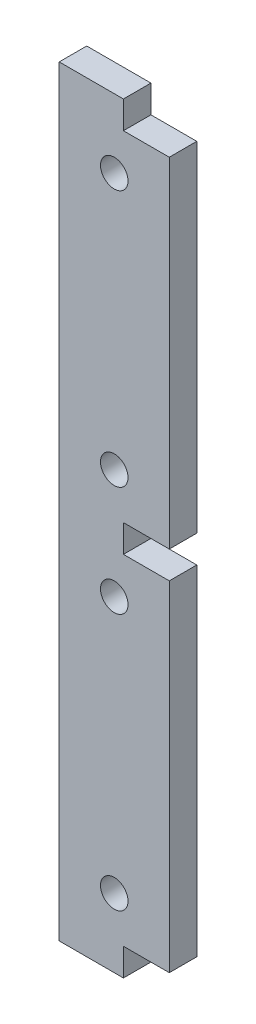
ISO-10303-21;
HEADER;
FILE_DESCRIPTION(('STEP AP214'),'2;1');
FILE_NAME('part.step','',(''),(''),'','','');
FILE_SCHEMA(('AUTOMOTIVE_DESIGN { 1 0 10303 214 1 1 1 1 }'));
ENDSEC;
DATA;
#1=APPLICATION_CONTEXT('core data for automotive mechanical design processes');
#2=APPLICATION_PROTOCOL_DEFINITION('international standard','automotive_design',2000,#1);
#3=PRODUCT_CONTEXT('',#1,'mechanical');
#4=PRODUCT('Part','Part','',(#3));
#5=PRODUCT_RELATED_PRODUCT_CATEGORY('part','',(#4));
#6=PRODUCT_DEFINITION_FORMATION('','',#4);
#7=PRODUCT_DEFINITION_CONTEXT('part definition',#1,'design');
#8=PRODUCT_DEFINITION('design','',#6,#7);
#9=PRODUCT_DEFINITION_SHAPE('','',#8);
#10=(LENGTH_UNIT() NAMED_UNIT(*) SI_UNIT(.MILLI.,.METRE.));
#11=(NAMED_UNIT(*) PLANE_ANGLE_UNIT() SI_UNIT($,.RADIAN.));
#12=(NAMED_UNIT(*) SI_UNIT($,.STERADIAN.) SOLID_ANGLE_UNIT());
#13=UNCERTAINTY_MEASURE_WITH_UNIT(LENGTH_MEASURE(1.E-05),#10,'distance_accuracy_value','');
#14=(GEOMETRIC_REPRESENTATION_CONTEXT(3) GLOBAL_UNCERTAINTY_ASSIGNED_CONTEXT((#13)) GLOBAL_UNIT_ASSIGNED_CONTEXT((#10,
#11,#12)) REPRESENTATION_CONTEXT('',''));
#15=CARTESIAN_POINT('',(0.,0.,0.));
#16=DIRECTION('',(0.,0.,1.));
#17=DIRECTION('',(1.,0.,0.));
#18=AXIS2_PLACEMENT_3D('',#15,#16,#17);
#19=CARTESIAN_POINT('',(0.,0.,3.));
#20=DIRECTION('',(0.,0.,1.));
#21=DIRECTION('',(1.,0.,0.));
#22=AXIS2_PLACEMENT_3D('',#19,#20,#21);
#23=PLANE('',#22);
#24=DIRECTION('',(1.,0.,0.));
#25=VECTOR('',#24,1.);
#26=CARTESIAN_POINT('',(-5.99999999999996,100.5,3.));
#27=LINE('',#26,#25);
#28=CARTESIAN_POINT('',(-5.99999999999996,100.5,3.));
#29=VERTEX_POINT('',#28);
#30=CARTESIAN_POINT('',(0.999999999999977,100.5,3.));
#31=VERTEX_POINT('',#30);
#32=EDGE_CURVE('E54',#29,#31,#27,.T.);
#33=ORIENTED_EDGE('',*,*,#32,.F.);
#34=DIRECTION('',(0.,-1.,0.));
#35=VECTOR('',#34,1.);
#36=CARTESIAN_POINT('',(-5.99999999999996,118.,3.));
#37=LINE('',#36,#35);
#38=CARTESIAN_POINT('',(-5.99999999999995,17.5,3.));
#39=VERTEX_POINT('',#38);
#40=EDGE_CURVE('E165',#29,#39,#37,.T.);
#41=ORIENTED_EDGE('',*,*,#40,.T.);
#42=DIRECTION('',(-1.,0.,0.));
#43=VECTOR('',#42,1.);
#44=CARTESIAN_POINT('',(-5.99999999999995,17.5,3.));
#45=LINE('',#44,#43);
#46=CARTESIAN_POINT('',(0.999999999999999,17.5,3.));
#47=VERTEX_POINT('',#46);
#48=EDGE_CURVE('E243',#47,#39,#45,.T.);
#49=ORIENTED_EDGE('',*,*,#48,.F.);
#50=DIRECTION('',(0.,1.,0.));
#51=VECTOR('',#50,1.);
#52=CARTESIAN_POINT('',(1.,20.5,3.));
#53=LINE('',#52,#51);
#54=CARTESIAN_POINT('',(1.,20.5,3.));
#55=VERTEX_POINT('',#54);
#56=EDGE_CURVE('E104',#47,#55,#53,.T.);
#57=ORIENTED_EDGE('',*,*,#56,.T.);
#58=DIRECTION('',(1.,0.,0.));
#59=VECTOR('',#58,1.);
#60=CARTESIAN_POINT('',(6.00000000000004,20.5,3.));
#61=LINE('',#60,#59);
#62=CARTESIAN_POINT('',(6.00000000000004,20.5,3.));
#63=VERTEX_POINT('',#62);
#64=EDGE_CURVE('E186',#55,#63,#61,.T.);
#65=ORIENTED_EDGE('',*,*,#64,.T.);
#66=DIRECTION('',(0.,1.,0.));
#67=VECTOR('',#66,1.);
#68=CARTESIAN_POINT('',(6.00000000000004,57.5,3.));
#69=LINE('',#68,#67);
#70=CARTESIAN_POINT('',(6.00000000000004,57.5,3.));
#71=VERTEX_POINT('',#70);
#72=EDGE_CURVE('E208',#63,#71,#69,.T.);
#73=ORIENTED_EDGE('',*,*,#72,.T.);
#74=DIRECTION('',(-1.,0.,0.));
#75=VECTOR('',#74,1.);
#76=CARTESIAN_POINT('',(0.999999999999985,57.5,3.));
#77=LINE('',#76,#75);
#78=CARTESIAN_POINT('',(0.999999999999985,57.5,3.));
#79=VERTEX_POINT('',#78);
#80=EDGE_CURVE('E205',#71,#79,#77,.T.);
#81=ORIENTED_EDGE('',*,*,#80,.T.);
#82=DIRECTION('',(0.,1.,0.));
#83=VECTOR('',#82,1.);
#84=CARTESIAN_POINT('',(0.999999999999986,60.5,3.));
#85=LINE('',#84,#83);
#86=CARTESIAN_POINT('',(0.999999999999986,60.5,3.));
#87=VERTEX_POINT('',#86);
#88=EDGE_CURVE('E207',#79,#87,#85,.T.);
#89=ORIENTED_EDGE('',*,*,#88,.T.);
#90=DIRECTION('',(1.,0.,0.));
#91=VECTOR('',#90,1.);
#92=CARTESIAN_POINT('',(6.00000000000004,60.5,3.));
#93=LINE('',#92,#91);
#94=CARTESIAN_POINT('',(6.00000000000004,60.5,3.));
#95=VERTEX_POINT('',#94);
#96=EDGE_CURVE('E128',#87,#95,#93,.T.);
#97=ORIENTED_EDGE('',*,*,#96,.T.);
#98=DIRECTION('',(0.,1.,0.));
#99=VECTOR('',#98,1.);
#100=CARTESIAN_POINT('',(6.00000000000003,97.5,3.));
#101=LINE('',#100,#99);
#102=CARTESIAN_POINT('',(6.00000000000003,97.5,3.));
#103=VERTEX_POINT('',#102);
#104=EDGE_CURVE('E123',#95,#103,#101,.T.);
#105=ORIENTED_EDGE('',*,*,#104,.T.);
#106=DIRECTION('',(-1.,0.,0.));
#107=VECTOR('',#106,1.);
#108=CARTESIAN_POINT('',(0.999999999999977,97.5,3.));
#109=LINE('',#108,#107);
#110=CARTESIAN_POINT('',(0.999999999999977,97.5,3.));
#111=VERTEX_POINT('',#110);
#112=EDGE_CURVE('E126',#103,#111,#109,.T.);
#113=ORIENTED_EDGE('',*,*,#112,.T.);
#114=DIRECTION('',(0.,1.,0.));
#115=VECTOR('',#114,1.);
#116=CARTESIAN_POINT('',(0.999999999999977,100.5,3.));
#117=LINE('',#116,#115);
#118=EDGE_CURVE('E138',#111,#31,#117,.T.);
#119=ORIENTED_EDGE('',*,*,#118,.T.);
#120=EDGE_LOOP('',(#33,#41,#49,#57,#65,#73,#81,#89,#97,#105,#113,#119));
#121=FACE_BOUND('',#120,.T.);
#122=CARTESIAN_POINT('',(0.,25.,3.));
#123=DIRECTION('',(0.,0.,1.));
#124=DIRECTION('',(1.,0.,0.));
#125=AXIS2_PLACEMENT_3D('',#122,#123,#124);
#126=CIRCLE('',#125,1.5);
#127=CARTESIAN_POINT('',(1.5,25.,3.));
#128=VERTEX_POINT('',#127);
#129=EDGE_CURVE('E232',#128,#128,#126,.T.);
#130=ORIENTED_EDGE('',*,*,#129,.F.);
#131=EDGE_LOOP('',(#130));
#132=FACE_BOUND('',#131,.T.);
#133=CARTESIAN_POINT('',(0.,65.,3.));
#134=DIRECTION('',(0.,0.,1.));
#135=DIRECTION('',(1.,0.,0.));
#136=AXIS2_PLACEMENT_3D('',#133,#134,#135);
#137=CIRCLE('',#136,1.5);
#138=CARTESIAN_POINT('',(1.50000000000001,65.,3.));
#139=VERTEX_POINT('',#138);
#140=EDGE_CURVE('E220',#139,#139,#137,.T.);
#141=ORIENTED_EDGE('',*,*,#140,.F.);
#142=EDGE_LOOP('',(#141));
#143=FACE_BOUND('',#142,.T.);
#144=CARTESIAN_POINT('',(0.,93.,3.));
#145=DIRECTION('',(0.,0.,1.));
#146=DIRECTION('',(-1.,0.,0.));
#147=AXIS2_PLACEMENT_3D('',#144,#145,#146);
#148=CIRCLE('',#147,1.5);
#149=CARTESIAN_POINT('',(-1.5,93.,3.));
#150=VERTEX_POINT('',#149);
#151=EDGE_CURVE('E148',#150,#150,#148,.T.);
#152=ORIENTED_EDGE('',*,*,#151,.F.);
#153=EDGE_LOOP('',(#152));
#154=FACE_BOUND('',#153,.T.);
#155=CARTESIAN_POINT('',(0.,53.,3.));
#156=DIRECTION('',(0.,0.,1.));
#157=DIRECTION('',(-1.,0.,0.));
#158=AXIS2_PLACEMENT_3D('',#155,#156,#157);
#159=CIRCLE('',#158,1.5);
#160=CARTESIAN_POINT('',(-1.49999999999999,53.,3.));
#161=VERTEX_POINT('',#160);
#162=EDGE_CURVE('E226',#161,#161,#159,.T.);
#163=ORIENTED_EDGE('',*,*,#162,.F.);
#164=EDGE_LOOP('',(#163));
#165=FACE_BOUND('',#164,.T.);
#166=ADVANCED_FACE('F37',(#121,#132,#143,#154,#165),#23,.T.);
#167=CARTESIAN_POINT('',(0.,0.,0.));
#168=DIRECTION('',(0.,0.,1.));
#169=DIRECTION('',(1.,0.,0.));
#170=AXIS2_PLACEMENT_3D('',#167,#168,#169);
#171=PLANE('',#170);
#172=DIRECTION('',(0.,-1.,0.));
#173=VECTOR('',#172,1.);
#174=CARTESIAN_POINT('',(-5.99999999999996,118.,0.));
#175=LINE('',#174,#173);
#176=CARTESIAN_POINT('',(-5.99999999999996,100.5,0.));
#177=VERTEX_POINT('',#176);
#178=CARTESIAN_POINT('',(-5.99999999999995,17.5,0.));
#179=VERTEX_POINT('',#178);
#180=EDGE_CURVE('E144',#177,#179,#175,.T.);
#181=ORIENTED_EDGE('',*,*,#180,.F.);
#182=DIRECTION('',(1.,0.,0.));
#183=VECTOR('',#182,1.);
#184=CARTESIAN_POINT('',(-5.99999999999996,100.5,0.));
#185=LINE('',#184,#183);
#186=CARTESIAN_POINT('',(0.999999999999977,100.5,0.));
#187=VERTEX_POINT('',#186);
#188=EDGE_CURVE('E250',#177,#187,#185,.T.);
#189=ORIENTED_EDGE('',*,*,#188,.T.);
#190=DIRECTION('',(0.,1.,0.));
#191=VECTOR('',#190,1.);
#192=CARTESIAN_POINT('',(0.999999999999977,100.5,0.));
#193=LINE('',#192,#191);
#194=CARTESIAN_POINT('',(0.999999999999977,97.5,0.));
#195=VERTEX_POINT('',#194);
#196=EDGE_CURVE('E162',#195,#187,#193,.T.);
#197=ORIENTED_EDGE('',*,*,#196,.F.);
#198=DIRECTION('',(-1.,0.,0.));
#199=VECTOR('',#198,1.);
#200=CARTESIAN_POINT('',(0.999999999999977,97.5,0.));
#201=LINE('',#200,#199);
#202=CARTESIAN_POINT('',(6.00000000000003,97.5,0.));
#203=VERTEX_POINT('',#202);
#204=EDGE_CURVE('E95',#203,#195,#201,.T.);
#205=ORIENTED_EDGE('',*,*,#204,.F.);
#206=DIRECTION('',(0.,1.,0.));
#207=VECTOR('',#206,1.);
#208=CARTESIAN_POINT('',(6.00000000000003,97.5,0.));
#209=LINE('',#208,#207);
#210=CARTESIAN_POINT('',(6.00000000000004,60.5,0.));
#211=VERTEX_POINT('',#210);
#212=EDGE_CURVE('E88',#211,#203,#209,.T.);
#213=ORIENTED_EDGE('',*,*,#212,.F.);
#214=DIRECTION('',(1.,0.,0.));
#215=VECTOR('',#214,1.);
#216=CARTESIAN_POINT('',(6.00000000000004,60.5,0.));
#217=LINE('',#216,#215);
#218=CARTESIAN_POINT('',(0.999999999999986,60.5,0.));
#219=VERTEX_POINT('',#218);
#220=EDGE_CURVE('E158',#219,#211,#217,.T.);
#221=ORIENTED_EDGE('',*,*,#220,.F.);
#222=DIRECTION('',(0.,1.,0.));
#223=VECTOR('',#222,1.);
#224=CARTESIAN_POINT('',(0.999999999999986,60.5,0.));
#225=LINE('',#224,#223);
#226=CARTESIAN_POINT('',(0.999999999999985,57.5,0.));
#227=VERTEX_POINT('',#226);
#228=EDGE_CURVE('E156',#227,#219,#225,.T.);
#229=ORIENTED_EDGE('',*,*,#228,.F.);
#230=DIRECTION('',(-1.,0.,0.));
#231=VECTOR('',#230,1.);
#232=CARTESIAN_POINT('',(0.999999999999985,57.5,0.));
#233=LINE('',#232,#231);
#234=CARTESIAN_POINT('',(6.00000000000004,57.5,0.));
#235=VERTEX_POINT('',#234);
#236=EDGE_CURVE('E154',#235,#227,#233,.T.);
#237=ORIENTED_EDGE('',*,*,#236,.F.);
#238=DIRECTION('',(0.,1.,0.));
#239=VECTOR('',#238,1.);
#240=CARTESIAN_POINT('',(6.00000000000004,57.5,0.));
#241=LINE('',#240,#239);
#242=CARTESIAN_POINT('',(6.00000000000004,20.5,0.));
#243=VERTEX_POINT('',#242);
#244=EDGE_CURVE('E152',#243,#235,#241,.T.);
#245=ORIENTED_EDGE('',*,*,#244,.F.);
#246=DIRECTION('',(1.,0.,0.));
#247=VECTOR('',#246,1.);
#248=CARTESIAN_POINT('',(6.00000000000004,20.5,0.));
#249=LINE('',#248,#247);
#250=CARTESIAN_POINT('',(1.,20.5,0.));
#251=VERTEX_POINT('',#250);
#252=EDGE_CURVE('E150',#251,#243,#249,.T.);
#253=ORIENTED_EDGE('',*,*,#252,.F.);
#254=DIRECTION('',(0.,1.,0.));
#255=VECTOR('',#254,1.);
#256=CARTESIAN_POINT('',(1.,20.5,0.));
#257=LINE('',#256,#255);
#258=CARTESIAN_POINT('',(1.,17.5,0.));
#259=VERTEX_POINT('',#258);
#260=EDGE_CURVE('E147',#259,#251,#257,.T.);
#261=ORIENTED_EDGE('',*,*,#260,.F.);
#262=DIRECTION('',(-1.,0.,0.));
#263=VECTOR('',#262,1.);
#264=CARTESIAN_POINT('',(-5.99999999999995,17.5,0.));
#265=LINE('',#264,#263);
#266=EDGE_CURVE('E241',#259,#179,#265,.T.);
#267=ORIENTED_EDGE('',*,*,#266,.T.);
#268=EDGE_LOOP('',(#181,#189,#197,#205,#213,#221,#229,#237,#245,#253,#261,#267));
#269=FACE_BOUND('',#268,.T.);
#270=CARTESIAN_POINT('',(0.,93.,0.));
#271=DIRECTION('',(0.,0.,1.));
#272=DIRECTION('',(-1.,0.,0.));
#273=AXIS2_PLACEMENT_3D('',#270,#271,#272);
#274=CIRCLE('',#273,1.5);
#275=CARTESIAN_POINT('',(-1.5,93.,0.));
#276=VERTEX_POINT('',#275);
#277=EDGE_CURVE('E217',#276,#276,#274,.T.);
#278=ORIENTED_EDGE('',*,*,#277,.T.);
#279=EDGE_LOOP('',(#278));
#280=FACE_BOUND('',#279,.T.);
#281=CARTESIAN_POINT('',(0.,65.,0.));
#282=DIRECTION('',(0.,0.,1.));
#283=DIRECTION('',(1.,0.,0.));
#284=AXIS2_PLACEMENT_3D('',#281,#282,#283);
#285=CIRCLE('',#284,1.5);
#286=CARTESIAN_POINT('',(1.50000000000001,65.,0.));
#287=VERTEX_POINT('',#286);
#288=EDGE_CURVE('E223',#287,#287,#285,.T.);
#289=ORIENTED_EDGE('',*,*,#288,.T.);
#290=EDGE_LOOP('',(#289));
#291=FACE_BOUND('',#290,.T.);
#292=CARTESIAN_POINT('',(0.,53.,0.));
#293=DIRECTION('',(0.,0.,1.));
#294=DIRECTION('',(-1.,0.,0.));
#295=AXIS2_PLACEMENT_3D('',#292,#293,#294);
#296=CIRCLE('',#295,1.5);
#297=CARTESIAN_POINT('',(-1.49999999999999,53.,0.));
#298=VERTEX_POINT('',#297);
#299=EDGE_CURVE('E229',#298,#298,#296,.T.);
#300=ORIENTED_EDGE('',*,*,#299,.T.);
#301=EDGE_LOOP('',(#300));
#302=FACE_BOUND('',#301,.T.);
#303=CARTESIAN_POINT('',(0.,25.,0.));
#304=DIRECTION('',(0.,0.,1.));
#305=DIRECTION('',(1.,0.,0.));
#306=AXIS2_PLACEMENT_3D('',#303,#304,#305);
#307=CIRCLE('',#306,1.5);
#308=CARTESIAN_POINT('',(1.5,25.,0.));
#309=VERTEX_POINT('',#308);
#310=EDGE_CURVE('E235',#309,#309,#307,.T.);
#311=ORIENTED_EDGE('',*,*,#310,.T.);
#312=EDGE_LOOP('',(#311));
#313=FACE_BOUND('',#312,.T.);
#314=ADVANCED_FACE('F192',(#269,#280,#291,#302,#313),#171,.F.);
#315=CARTESIAN_POINT('',(-5.99999999999996,118.,3.));
#316=DIRECTION('',(1.,0.,0.));
#317=DIRECTION('',(0.,1.,0.));
#318=AXIS2_PLACEMENT_3D('',#315,#316,#317);
#319=PLANE('',#318);
#320=ORIENTED_EDGE('',*,*,#40,.F.);
#321=DIRECTION('',(0.,0.,1.));
#322=VECTOR('',#321,1.);
#323=CARTESIAN_POINT('',(-5.99999999999996,100.5,0.));
#324=LINE('',#323,#322);
#325=EDGE_CURVE('E238',#177,#29,#324,.T.);
#326=ORIENTED_EDGE('',*,*,#325,.F.);
#327=ORIENTED_EDGE('',*,*,#180,.T.);
#328=DIRECTION('',(0.,0.,1.));
#329=VECTOR('',#328,1.);
#330=CARTESIAN_POINT('',(-5.99999999999995,17.5,0.));
#331=LINE('',#330,#329);
#332=EDGE_CURVE('E244',#179,#39,#331,.T.);
#333=ORIENTED_EDGE('',*,*,#332,.T.);
#334=EDGE_LOOP('',(#320,#326,#327,#333));
#335=FACE_BOUND('',#334,.T.);
#336=ADVANCED_FACE('F39',(#335),#319,.F.);
#337=CARTESIAN_POINT('',(1.,20.5,3.));
#338=DIRECTION('',(-1.,0.,0.));
#339=DIRECTION('',(0.,0.,1.));
#340=AXIS2_PLACEMENT_3D('',#337,#338,#339);
#341=PLANE('',#340);
#342=ORIENTED_EDGE('',*,*,#260,.T.);
#343=DIRECTION('',(0.,0.,-1.));
#344=VECTOR('',#343,1.);
#345=CARTESIAN_POINT('',(1.,20.5,3.));
#346=LINE('',#345,#344);
#347=EDGE_CURVE('E46',#55,#251,#346,.T.);
#348=ORIENTED_EDGE('',*,*,#347,.F.);
#349=ORIENTED_EDGE('',*,*,#56,.F.);
#350=DIRECTION('',(0.,0.,-1.));
#351=VECTOR('',#350,1.);
#352=CARTESIAN_POINT('',(1.,17.5,3.));
#353=LINE('',#352,#351);
#354=EDGE_CURVE('E11',#47,#259,#353,.T.);
#355=ORIENTED_EDGE('',*,*,#354,.T.);
#356=EDGE_LOOP('',(#342,#348,#349,#355));
#357=FACE_BOUND('',#356,.T.);
#358=ADVANCED_FACE('F274',(#357),#341,.F.);
#359=CARTESIAN_POINT('',(6.00000000000004,20.5,3.));
#360=DIRECTION('',(0.,1.,0.));
#361=DIRECTION('',(0.,0.,1.));
#362=AXIS2_PLACEMENT_3D('',#359,#360,#361);
#363=PLANE('',#362);
#364=ORIENTED_EDGE('',*,*,#252,.T.);
#365=DIRECTION('',(0.,0.,-1.));
#366=VECTOR('',#365,1.);
#367=CARTESIAN_POINT('',(6.00000000000004,20.5,3.));
#368=LINE('',#367,#366);
#369=EDGE_CURVE('E178',#63,#243,#368,.T.);
#370=ORIENTED_EDGE('',*,*,#369,.F.);
#371=ORIENTED_EDGE('',*,*,#64,.F.);
#372=ORIENTED_EDGE('',*,*,#347,.T.);
#373=EDGE_LOOP('',(#364,#370,#371,#372));
#374=FACE_BOUND('',#373,.T.);
#375=ADVANCED_FACE('F184',(#374),#363,.F.);
#376=CARTESIAN_POINT('',(6.00000000000004,57.5,3.));
#377=DIRECTION('',(-1.,0.,0.));
#378=DIRECTION('',(0.,-1.,0.));
#379=AXIS2_PLACEMENT_3D('',#376,#377,#378);
#380=PLANE('',#379);
#381=ORIENTED_EDGE('',*,*,#244,.T.);
#382=DIRECTION('',(0.,0.,-1.));
#383=VECTOR('',#382,1.);
#384=CARTESIAN_POINT('',(6.00000000000004,57.5,3.));
#385=LINE('',#384,#383);
#386=EDGE_CURVE('E175',#71,#235,#385,.T.);
#387=ORIENTED_EDGE('',*,*,#386,.F.);
#388=ORIENTED_EDGE('',*,*,#72,.F.);
#389=ORIENTED_EDGE('',*,*,#369,.T.);
#390=EDGE_LOOP('',(#381,#387,#388,#389));
#391=FACE_BOUND('',#390,.T.);
#392=ADVANCED_FACE('F199',(#391),#380,.F.);
#393=CARTESIAN_POINT('',(0.999999999999985,57.5,3.));
#394=DIRECTION('',(0.,-1.,0.));
#395=DIRECTION('',(0.,0.,-1.));
#396=AXIS2_PLACEMENT_3D('',#393,#394,#395);
#397=PLANE('',#396);
#398=ORIENTED_EDGE('',*,*,#236,.T.);
#399=DIRECTION('',(0.,0.,-1.));
#400=VECTOR('',#399,1.);
#401=CARTESIAN_POINT('',(0.999999999999985,57.5,3.));
#402=LINE('',#401,#400);
#403=EDGE_CURVE('E172',#79,#227,#402,.T.);
#404=ORIENTED_EDGE('',*,*,#403,.F.);
#405=ORIENTED_EDGE('',*,*,#80,.F.);
#406=ORIENTED_EDGE('',*,*,#386,.T.);
#407=EDGE_LOOP('',(#398,#404,#405,#406));
#408=FACE_BOUND('',#407,.T.);
#409=ADVANCED_FACE('F203',(#408),#397,.F.);
#410=CARTESIAN_POINT('',(0.999999999999986,60.5,3.));
#411=DIRECTION('',(-1.,0.,0.));
#412=DIRECTION('',(0.,-1.,0.));
#413=AXIS2_PLACEMENT_3D('',#410,#411,#412);
#414=PLANE('',#413);
#415=ORIENTED_EDGE('',*,*,#228,.T.);
#416=DIRECTION('',(0.,0.,-1.));
#417=VECTOR('',#416,1.);
#418=CARTESIAN_POINT('',(0.999999999999986,60.5,3.));
#419=LINE('',#418,#417);
#420=EDGE_CURVE('E169',#87,#219,#419,.T.);
#421=ORIENTED_EDGE('',*,*,#420,.F.);
#422=ORIENTED_EDGE('',*,*,#88,.F.);
#423=ORIENTED_EDGE('',*,*,#403,.T.);
#424=EDGE_LOOP('',(#415,#421,#422,#423));
#425=FACE_BOUND('',#424,.T.);
#426=ADVANCED_FACE('F300',(#425),#414,.F.);
#427=CARTESIAN_POINT('',(6.00000000000004,60.5,3.));
#428=DIRECTION('',(0.,1.,0.));
#429=DIRECTION('',(0.,0.,1.));
#430=AXIS2_PLACEMENT_3D('',#427,#428,#429);
#431=PLANE('',#430);
#432=ORIENTED_EDGE('',*,*,#220,.T.);
#433=DIRECTION('',(0.,0.,-1.));
#434=VECTOR('',#433,1.);
#435=CARTESIAN_POINT('',(6.00000000000004,60.5,3.));
#436=LINE('',#435,#434);
#437=EDGE_CURVE('E133',#95,#211,#436,.T.);
#438=ORIENTED_EDGE('',*,*,#437,.F.);
#439=ORIENTED_EDGE('',*,*,#96,.F.);
#440=ORIENTED_EDGE('',*,*,#420,.T.);
#441=EDGE_LOOP('',(#432,#438,#439,#440));
#442=FACE_BOUND('',#441,.T.);
#443=ADVANCED_FACE('F297',(#442),#431,.F.);
#444=CARTESIAN_POINT('',(6.00000000000003,97.5,3.));
#445=DIRECTION('',(-1.,0.,0.));
#446=DIRECTION('',(0.,-1.,0.));
#447=AXIS2_PLACEMENT_3D('',#444,#445,#446);
#448=PLANE('',#447);
#449=ORIENTED_EDGE('',*,*,#212,.T.);
#450=DIRECTION('',(0.,0.,-1.));
#451=VECTOR('',#450,1.);
#452=CARTESIAN_POINT('',(6.00000000000003,97.5,3.));
#453=LINE('',#452,#451);
#454=EDGE_CURVE('E131',#103,#203,#453,.T.);
#455=ORIENTED_EDGE('',*,*,#454,.F.);
#456=ORIENTED_EDGE('',*,*,#104,.F.);
#457=ORIENTED_EDGE('',*,*,#437,.T.);
#458=EDGE_LOOP('',(#449,#455,#456,#457));
#459=FACE_BOUND('',#458,.T.);
#460=ADVANCED_FACE('F132',(#459),#448,.F.);
#461=CARTESIAN_POINT('',(0.999999999999977,97.5,3.));
#462=DIRECTION('',(0.,-1.,0.));
#463=DIRECTION('',(0.,0.,-1.));
#464=AXIS2_PLACEMENT_3D('',#461,#462,#463);
#465=PLANE('',#464);
#466=ORIENTED_EDGE('',*,*,#204,.T.);
#467=DIRECTION('',(0.,0.,-1.));
#468=VECTOR('',#467,1.);
#469=CARTESIAN_POINT('',(0.999999999999977,97.5,3.));
#470=LINE('',#469,#468);
#471=EDGE_CURVE('E134',#111,#195,#470,.T.);
#472=ORIENTED_EDGE('',*,*,#471,.F.);
#473=ORIENTED_EDGE('',*,*,#112,.F.);
#474=ORIENTED_EDGE('',*,*,#454,.T.);
#475=EDGE_LOOP('',(#466,#472,#473,#474));
#476=FACE_BOUND('',#475,.T.);
#477=ADVANCED_FACE('F136',(#476),#465,.F.);
#478=CARTESIAN_POINT('',(0.999999999999977,100.5,3.));
#479=DIRECTION('',(-1.,0.,0.));
#480=DIRECTION('',(0.,-1.,0.));
#481=AXIS2_PLACEMENT_3D('',#478,#479,#480);
#482=PLANE('',#481);
#483=ORIENTED_EDGE('',*,*,#196,.T.);
#484=DIRECTION('',(0.,0.,-1.));
#485=VECTOR('',#484,1.);
#486=CARTESIAN_POINT('',(0.999999999999977,100.5,3.));
#487=LINE('',#486,#485);
#488=EDGE_CURVE('E140',#31,#187,#487,.T.);
#489=ORIENTED_EDGE('',*,*,#488,.F.);
#490=ORIENTED_EDGE('',*,*,#118,.F.);
#491=ORIENTED_EDGE('',*,*,#471,.T.);
#492=EDGE_LOOP('',(#483,#489,#490,#491));
#493=FACE_BOUND('',#492,.T.);
#494=ADVANCED_FACE('F260',(#493),#482,.F.);
#495=CARTESIAN_POINT('',(0.,93.,3.));
#496=DIRECTION('',(0.,0.,-1.));
#497=DIRECTION('',(-1.,0.,0.));
#498=AXIS2_PLACEMENT_3D('',#495,#496,#497);
#499=CYLINDRICAL_SURFACE('',#498,1.5);
#500=ORIENTED_EDGE('',*,*,#151,.T.);
#501=EDGE_LOOP('',(#500));
#502=FACE_BOUND('',#501,.T.);
#503=ORIENTED_EDGE('',*,*,#277,.F.);
#504=EDGE_LOOP('',(#503));
#505=FACE_BOUND('',#504,.T.);
#506=ADVANCED_FACE('F288',(#502,#505),#499,.F.);
#507=CARTESIAN_POINT('',(0.,65.,3.));
#508=DIRECTION('',(0.,0.,-1.));
#509=DIRECTION('',(-1.,0.,0.));
#510=AXIS2_PLACEMENT_3D('',#507,#508,#509);
#511=CYLINDRICAL_SURFACE('',#510,1.5);
#512=ORIENTED_EDGE('',*,*,#140,.T.);
#513=EDGE_LOOP('',(#512));
#514=FACE_BOUND('',#513,.T.);
#515=ORIENTED_EDGE('',*,*,#288,.F.);
#516=EDGE_LOOP('',(#515));
#517=FACE_BOUND('',#516,.T.);
#518=ADVANCED_FACE('F343',(#514,#517),#511,.F.);
#519=CARTESIAN_POINT('',(0.,53.,3.));
#520=DIRECTION('',(0.,0.,-1.));
#521=DIRECTION('',(-1.,0.,0.));
#522=AXIS2_PLACEMENT_3D('',#519,#520,#521);
#523=CYLINDRICAL_SURFACE('',#522,1.5);
#524=ORIENTED_EDGE('',*,*,#162,.T.);
#525=EDGE_LOOP('',(#524));
#526=FACE_BOUND('',#525,.T.);
#527=ORIENTED_EDGE('',*,*,#299,.F.);
#528=EDGE_LOOP('',(#527));
#529=FACE_BOUND('',#528,.T.);
#530=ADVANCED_FACE('F350',(#526,#529),#523,.F.);
#531=CARTESIAN_POINT('',(0.,25.,3.));
#532=DIRECTION('',(0.,0.,-1.));
#533=DIRECTION('',(-1.,0.,0.));
#534=AXIS2_PLACEMENT_3D('',#531,#532,#533);
#535=CYLINDRICAL_SURFACE('',#534,1.5);
#536=ORIENTED_EDGE('',*,*,#129,.T.);
#537=EDGE_LOOP('',(#536));
#538=FACE_BOUND('',#537,.T.);
#539=ORIENTED_EDGE('',*,*,#310,.F.);
#540=EDGE_LOOP('',(#539));
#541=FACE_BOUND('',#540,.T.);
#542=ADVANCED_FACE('F357',(#538,#541),#535,.F.);
#543=CARTESIAN_POINT('',(-5.99999999999996,100.5,0.));
#544=DIRECTION('',(0.,-1.,0.));
#545=DIRECTION('',(0.,0.,-1.));
#546=AXIS2_PLACEMENT_3D('',#543,#544,#545);
#547=PLANE('',#546);
#548=ORIENTED_EDGE('',*,*,#188,.F.);
#549=ORIENTED_EDGE('',*,*,#325,.T.);
#550=ORIENTED_EDGE('',*,*,#32,.T.);
#551=ORIENTED_EDGE('',*,*,#488,.T.);
#552=EDGE_LOOP('',(#548,#549,#550,#551));
#553=FACE_BOUND('',#552,.T.);
#554=ADVANCED_FACE('F365',(#553),#547,.F.);
#555=CARTESIAN_POINT('',(-5.99999999999995,17.5,0.));
#556=DIRECTION('',(0.,1.,0.));
#557=DIRECTION('',(0.,0.,1.));
#558=AXIS2_PLACEMENT_3D('',#555,#556,#557);
#559=PLANE('',#558);
#560=ORIENTED_EDGE('',*,*,#48,.T.);
#561=ORIENTED_EDGE('',*,*,#332,.F.);
#562=ORIENTED_EDGE('',*,*,#266,.F.);
#563=ORIENTED_EDGE('',*,*,#354,.F.);
#564=EDGE_LOOP('',(#560,#561,#562,#563));
#565=FACE_BOUND('',#564,.T.);
#566=ADVANCED_FACE('F270',(#565),#559,.F.);
#567=CLOSED_SHELL('',(#166,#314,#336,#358,#375,#392,#409,#426,#443,#460,#477,#494,#506,#518,
#530,#542,#554,#566));
#568=MANIFOLD_SOLID_BREP('B2',#567);
#569=ADVANCED_BREP_SHAPE_REPRESENTATION('',(#18,#568),#14);
#570=SHAPE_DEFINITION_REPRESENTATION(#9,#569);
ENDSEC;
END-ISO-10303-21;
